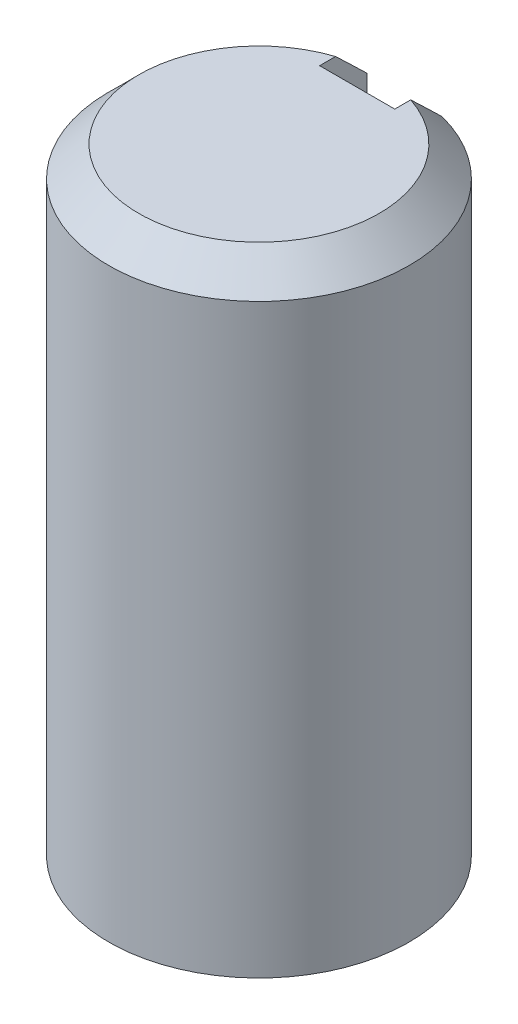
ISO-10303-21;
HEADER;
FILE_DESCRIPTION(('STEP AP214'),'2;1');
FILE_NAME('part.step','',(''),(''),'','','');
FILE_SCHEMA(('AUTOMOTIVE_DESIGN { 1 0 10303 214 1 1 1 1 }'));
ENDSEC;
DATA;
#1=APPLICATION_CONTEXT('core data for automotive mechanical design processes');
#2=APPLICATION_PROTOCOL_DEFINITION('international standard','automotive_design',2000,#1);
#3=PRODUCT_CONTEXT('',#1,'mechanical');
#4=PRODUCT('Part','Part','',(#3));
#5=PRODUCT_RELATED_PRODUCT_CATEGORY('part','',(#4));
#6=PRODUCT_DEFINITION_FORMATION('','',#4);
#7=PRODUCT_DEFINITION_CONTEXT('part definition',#1,'design');
#8=PRODUCT_DEFINITION('design','',#6,#7);
#9=PRODUCT_DEFINITION_SHAPE('','',#8);
#10=(LENGTH_UNIT() NAMED_UNIT(*) SI_UNIT(.MILLI.,.METRE.));
#11=(NAMED_UNIT(*) PLANE_ANGLE_UNIT() SI_UNIT($,.RADIAN.));
#12=(NAMED_UNIT(*) SI_UNIT($,.STERADIAN.) SOLID_ANGLE_UNIT());
#13=UNCERTAINTY_MEASURE_WITH_UNIT(LENGTH_MEASURE(1.E-05),#10,'distance_accuracy_value','');
#14=(GEOMETRIC_REPRESENTATION_CONTEXT(3) GLOBAL_UNCERTAINTY_ASSIGNED_CONTEXT((#13)) GLOBAL_UNIT_ASSIGNED_CONTEXT((#10,
#11,#12)) REPRESENTATION_CONTEXT('',''));
#15=CARTESIAN_POINT('',(0.,0.,0.));
#16=DIRECTION('',(0.,0.,1.));
#17=DIRECTION('',(1.,0.,0.));
#18=AXIS2_PLACEMENT_3D('',#15,#16,#17);
#19=CARTESIAN_POINT('',(0.,41.,0.));
#20=DIRECTION('',(0.,-1.,0.));
#21=DIRECTION('',(0.,0.,-1.));
#22=AXIS2_PLACEMENT_3D('',#19,#20,#21);
#23=CYLINDRICAL_SURFACE('',#22,10.);
#24=DIRECTION('',(0.,-1.,0.));
#25=VECTOR('',#24,1.);
#26=CARTESIAN_POINT('',(2.5,41.,-9.68245836551854));
#27=LINE('',#26,#25);
#28=CARTESIAN_POINT('',(2.5,0.,-9.68245836551854));
#29=VERTEX_POINT('',#28);
#30=CARTESIAN_POINT('',(2.5,39.,-9.68245836551854));
#31=VERTEX_POINT('',#30);
#32=EDGE_CURVE('E109',#29,#31,#27,.F.);
#33=ORIENTED_EDGE('',*,*,#32,.T.);
#34=CARTESIAN_POINT('',(0.,39.,0.));
#35=DIRECTION('',(0.,1.,0.));
#36=DIRECTION('',(0.,0.,1.));
#37=AXIS2_PLACEMENT_3D('',#34,#35,#36);
#38=CIRCLE('',#37,10.);
#39=CARTESIAN_POINT('',(-2.5,39.,-9.68245836551855));
#40=VERTEX_POINT('',#39);
#41=EDGE_CURVE('E46',#31,#40,#38,.F.);
#42=ORIENTED_EDGE('',*,*,#41,.T.);
#43=DIRECTION('',(0.,-1.,0.));
#44=VECTOR('',#43,1.);
#45=CARTESIAN_POINT('',(-2.5,41.,-9.68245836551855));
#46=LINE('',#45,#44);
#47=CARTESIAN_POINT('',(-2.5,0.,-9.68245836551855));
#48=VERTEX_POINT('',#47);
#49=EDGE_CURVE('E112',#40,#48,#46,.T.);
#50=ORIENTED_EDGE('',*,*,#49,.T.);
#51=CARTESIAN_POINT('',(0.,0.,0.));
#52=DIRECTION('',(0.,1.,0.));
#53=DIRECTION('',(0.,0.,1.));
#54=AXIS2_PLACEMENT_3D('',#51,#52,#53);
#55=CIRCLE('',#54,10.);
#56=EDGE_CURVE('E114',#48,#29,#55,.T.);
#57=ORIENTED_EDGE('',*,*,#56,.T.);
#58=EDGE_LOOP('',(#33,#42,#50,#57));
#59=FACE_BOUND('',#58,.T.);
#60=ADVANCED_FACE('F33',(#59),#23,.T.);
#61=CARTESIAN_POINT('',(0.,41.,0.));
#62=DIRECTION('',(0.,1.,0.));
#63=DIRECTION('',(0.,0.,1.));
#64=AXIS2_PLACEMENT_3D('',#61,#62,#63);
#65=PLANE('',#64);
#66=DIRECTION('',(0.,0.,1.));
#67=VECTOR('',#66,1.);
#68=CARTESIAN_POINT('',(-2.5,41.,-10.4525053077231));
#69=LINE('',#68,#67);
#70=CARTESIAN_POINT('',(-2.5,41.,-7.59934207678532));
#71=VERTEX_POINT('',#70);
#72=CARTESIAN_POINT('',(-2.5,41.,-6.53834841531101));
#73=VERTEX_POINT('',#72);
#74=EDGE_CURVE('E83',#71,#73,#69,.T.);
#75=ORIENTED_EDGE('',*,*,#74,.F.);
#76=CARTESIAN_POINT('',(0.,41.,0.));
#77=DIRECTION('',(0.,1.,0.));
#78=DIRECTION('',(0.,0.,1.));
#79=AXIS2_PLACEMENT_3D('',#76,#77,#78);
#80=CIRCLE('',#79,7.99999999999999);
#81=CARTESIAN_POINT('',(2.5,41.,-7.59934207678532));
#82=VERTEX_POINT('',#81);
#83=EDGE_CURVE('E123',#71,#82,#80,.T.);
#84=ORIENTED_EDGE('',*,*,#83,.T.);
#85=DIRECTION('',(0.,0.,-1.));
#86=VECTOR('',#85,1.);
#87=CARTESIAN_POINT('',(2.5,41.,-10.4525053077231));
#88=LINE('',#87,#86);
#89=CARTESIAN_POINT('',(2.5,41.,-6.53834841531101));
#90=VERTEX_POINT('',#89);
#91=EDGE_CURVE('E103',#90,#82,#88,.T.);
#92=ORIENTED_EDGE('',*,*,#91,.F.);
#93=DIRECTION('',(1.,0.,0.));
#94=VECTOR('',#93,1.);
#95=CARTESIAN_POINT('',(-2.5,41.,-6.53834841531101));
#96=LINE('',#95,#94);
#97=EDGE_CURVE('E94',#73,#90,#96,.T.);
#98=ORIENTED_EDGE('',*,*,#97,.F.);
#99=EDGE_LOOP('',(#75,#84,#92,#98));
#100=FACE_BOUND('',#99,.T.);
#101=ADVANCED_FACE('F105',(#100),#65,.T.);
#102=CARTESIAN_POINT('',(0.,0.,0.));
#103=DIRECTION('',(0.,1.,0.));
#104=DIRECTION('',(0.,0.,1.));
#105=AXIS2_PLACEMENT_3D('',#102,#103,#104);
#106=PLANE('',#105);
#107=ORIENTED_EDGE('',*,*,#56,.F.);
#108=DIRECTION('',(0.,0.,1.));
#109=VECTOR('',#108,1.);
#110=CARTESIAN_POINT('',(-2.5,0.,0.));
#111=LINE('',#110,#109);
#112=CARTESIAN_POINT('',(-2.5,0.,-6.53834841531101));
#113=VERTEX_POINT('',#112);
#114=EDGE_CURVE('E121',#48,#113,#111,.T.);
#115=ORIENTED_EDGE('',*,*,#114,.T.);
#116=DIRECTION('',(1.,0.,0.));
#117=VECTOR('',#116,1.);
#118=CARTESIAN_POINT('',(0.,0.,-6.53834841531101));
#119=LINE('',#118,#117);
#120=CARTESIAN_POINT('',(2.5,0.,-6.53834841531101));
#121=VERTEX_POINT('',#120);
#122=EDGE_CURVE('E101',#113,#121,#119,.T.);
#123=ORIENTED_EDGE('',*,*,#122,.T.);
#124=DIRECTION('',(0.,0.,-1.));
#125=VECTOR('',#124,1.);
#126=CARTESIAN_POINT('',(2.5,0.,0.));
#127=LINE('',#126,#125);
#128=EDGE_CURVE('E118',#121,#29,#127,.T.);
#129=ORIENTED_EDGE('',*,*,#128,.T.);
#130=EDGE_LOOP('',(#107,#115,#123,#129));
#131=FACE_BOUND('',#130,.T.);
#132=ADVANCED_FACE('F137',(#131),#106,.F.);
#133=CARTESIAN_POINT('',(-2.5,-7.00000000000001,-10.4525053077231));
#134=DIRECTION('',(-1.,0.,0.));
#135=DIRECTION('',(0.,0.,1.));
#136=AXIS2_PLACEMENT_3D('',#133,#134,#135);
#137=PLANE('',#136);
#138=ORIENTED_EDGE('',*,*,#49,.F.);
#139=CARTESIAN_POINT('',(-2.5,39.,-9.68245836551855));
#140=CARTESIAN_POINT('',(-2.5,39.1673969910417,-9.50956773189023));
#141=CARTESIAN_POINT('',(-2.5,39.3346531860786,-9.33654057343359));
#142=CARTESIAN_POINT('',(-2.5,39.668823668122,-8.99015830092179));
#143=CARTESIAN_POINT('',(-2.5,39.8357379570264,-8.81680318869741));
#144=CARTESIAN_POINT('',(-2.5,40.1691664610513,-8.46970788215021));
#145=CARTESIAN_POINT('',(-2.5,40.3356806754864,-8.29596768716852));
#146=CARTESIAN_POINT('',(-2.5,40.6682249102121,-7.94802275063825));
#147=CARTESIAN_POINT('',(-2.5,40.8342549277948,-7.773818006502));
#148=CARTESIAN_POINT('',(-2.5,41.,-7.59934207678532));
#149=B_SPLINE_CURVE_WITH_KNOTS('',3,(#139,#140,#141,#142,#143,#144,#145,#146,#147,#148),
.UNSPECIFIED.,.F.,.F.,(4,2,2,2,4),(0.,0.721953250390488,1.4439024823584,2.16585295053371,
2.88780744863023),.UNSPECIFIED.);
#150=EDGE_CURVE('E11',#40,#71,#149,.T.);
#151=ORIENTED_EDGE('',*,*,#150,.T.);
#152=ORIENTED_EDGE('',*,*,#74,.T.);
#153=DIRECTION('',(0.,1.,0.));
#154=VECTOR('',#153,1.);
#155=CARTESIAN_POINT('',(-2.5,-7.00000000000001,-6.53834841531101));
#156=LINE('',#155,#154);
#157=EDGE_CURVE('E87',#113,#73,#156,.T.);
#158=ORIENTED_EDGE('',*,*,#157,.F.);
#159=ORIENTED_EDGE('',*,*,#114,.F.);
#160=EDGE_LOOP('',(#138,#151,#152,#158,#159));
#161=FACE_BOUND('',#160,.T.);
#162=ADVANCED_FACE('F85',(#161),#137,.F.);
#163=CARTESIAN_POINT('',(2.5,-7.00000000000001,-10.4525053077231));
#164=DIRECTION('',(1.,0.,0.));
#165=DIRECTION('',(0.,0.,-1.));
#166=AXIS2_PLACEMENT_3D('',#163,#164,#165);
#167=PLANE('',#166);
#168=ORIENTED_EDGE('',*,*,#91,.T.);
#169=CARTESIAN_POINT('',(2.5,41.,-7.59934207678532));
#170=CARTESIAN_POINT('',(2.5,40.8342549277948,-7.773818006502));
#171=CARTESIAN_POINT('',(2.5,40.6682249102121,-7.94802275063825));
#172=CARTESIAN_POINT('',(2.5,40.3356806754864,-8.29596768716852));
#173=CARTESIAN_POINT('',(2.5,40.1691664610513,-8.46970788215021));
#174=CARTESIAN_POINT('',(2.5,39.8357379570264,-8.81680318869741));
#175=CARTESIAN_POINT('',(2.5,39.668823668122,-8.99015830092179));
#176=CARTESIAN_POINT('',(2.5,39.3346531860786,-9.33654057343359));
#177=CARTESIAN_POINT('',(2.5,39.1673969910417,-9.50956773189024));
#178=CARTESIAN_POINT('',(2.5,39.,-9.68245836551855));
#179=B_SPLINE_CURVE_WITH_KNOTS('',3,(#169,#170,#171,#172,#173,#174,#175,#176,#177,#178),
.UNSPECIFIED.,.F.,.F.,(4,2,2,2,4),(0.,0.721954498096514,1.44390496627182,2.16585419823974,
2.88780744863023),.UNSPECIFIED.);
#180=EDGE_CURVE('E60',#82,#31,#179,.T.);
#181=ORIENTED_EDGE('',*,*,#180,.T.);
#182=ORIENTED_EDGE('',*,*,#32,.F.);
#183=ORIENTED_EDGE('',*,*,#128,.F.);
#184=DIRECTION('',(0.,1.,0.));
#185=VECTOR('',#184,1.);
#186=CARTESIAN_POINT('',(2.5,-7.00000000000001,-6.53834841531101));
#187=LINE('',#186,#185);
#188=EDGE_CURVE('E102',#121,#90,#187,.T.);
#189=ORIENTED_EDGE('',*,*,#188,.T.);
#190=EDGE_LOOP('',(#168,#181,#182,#183,#189));
#191=FACE_BOUND('',#190,.T.);
#192=ADVANCED_FACE('F129',(#191),#167,.F.);
#193=CARTESIAN_POINT('',(-2.5,-7.00000000000001,-6.53834841531101));
#194=DIRECTION('',(0.,0.,1.));
#195=DIRECTION('',(1.,0.,0.));
#196=AXIS2_PLACEMENT_3D('',#193,#194,#195);
#197=PLANE('',#196);
#198=ORIENTED_EDGE('',*,*,#157,.T.);
#199=ORIENTED_EDGE('',*,*,#97,.T.);
#200=ORIENTED_EDGE('',*,*,#188,.F.);
#201=ORIENTED_EDGE('',*,*,#122,.F.);
#202=EDGE_LOOP('',(#198,#199,#200,#201));
#203=FACE_BOUND('',#202,.T.);
#204=ADVANCED_FACE('F98',(#203),#197,.F.);
#205=CARTESIAN_POINT('',(0.,41.,0.));
#206=DIRECTION('',(0.,-1.,0.));
#207=DIRECTION('',(0.,0.,-1.));
#208=AXIS2_PLACEMENT_3D('',#205,#206,#207);
#209=CONICAL_SURFACE('',#208,7.99999999999999,0.785398163397448);
#210=ORIENTED_EDGE('',*,*,#150,.F.);
#211=ORIENTED_EDGE('',*,*,#41,.F.);
#212=ORIENTED_EDGE('',*,*,#180,.F.);
#213=ORIENTED_EDGE('',*,*,#83,.F.);
#214=EDGE_LOOP('',(#210,#211,#212,#213));
#215=FACE_BOUND('',#214,.T.);
#216=ADVANCED_FACE('F35',(#215),#209,.T.);
#217=CLOSED_SHELL('',(#60,#101,#132,#162,#192,#204,#216));
#218=MANIFOLD_SOLID_BREP('B2',#217);
#219=ADVANCED_BREP_SHAPE_REPRESENTATION('',(#18,#218),#14);
#220=SHAPE_DEFINITION_REPRESENTATION(#9,#219);
ENDSEC;
END-ISO-10303-21;
